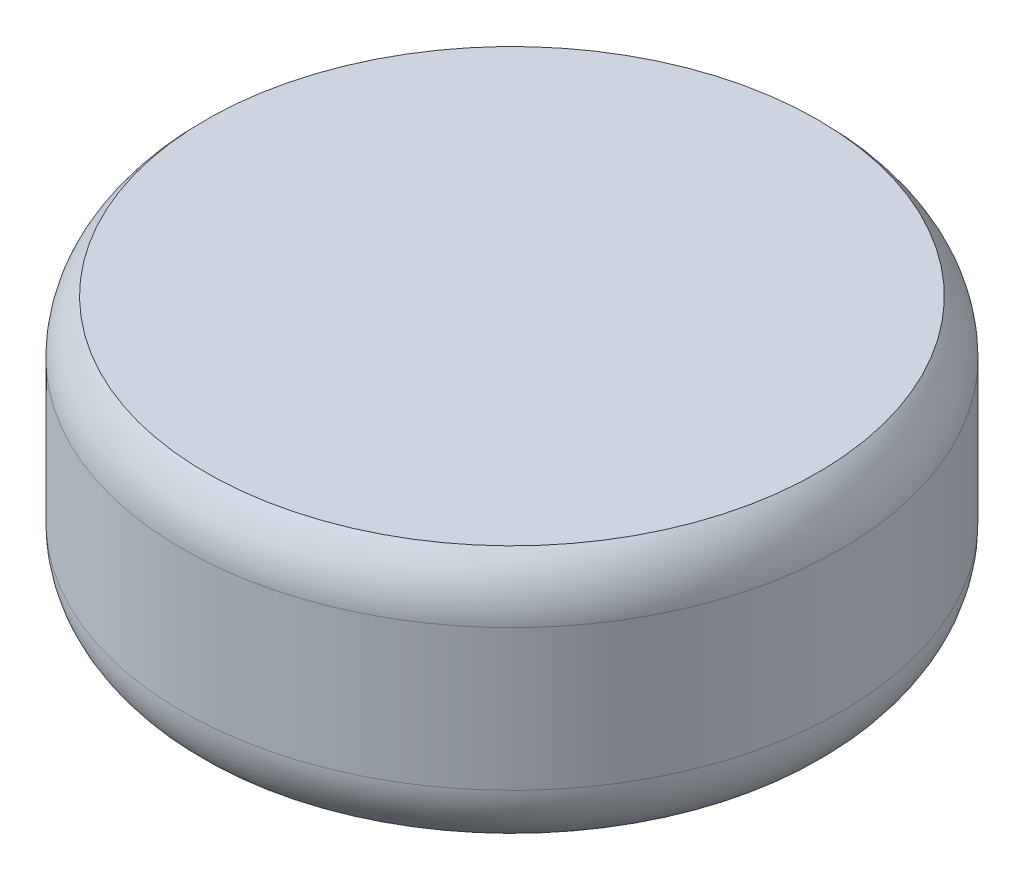
ISO-10303-21;
HEADER;
FILE_DESCRIPTION(('STEP AP214'),'2;1');
FILE_NAME('part.step','',(''),(''),'','','');
FILE_SCHEMA(('AUTOMOTIVE_DESIGN { 1 0 10303 214 1 1 1 1 }'));
ENDSEC;
DATA;
#1=APPLICATION_CONTEXT('core data for automotive mechanical design processes');
#2=APPLICATION_PROTOCOL_DEFINITION('international standard','automotive_design',2000,#1);
#3=PRODUCT_CONTEXT('',#1,'mechanical');
#4=PRODUCT('Part','Part','',(#3));
#5=PRODUCT_RELATED_PRODUCT_CATEGORY('part','',(#4));
#6=PRODUCT_DEFINITION_FORMATION('','',#4);
#7=PRODUCT_DEFINITION_CONTEXT('part definition',#1,'design');
#8=PRODUCT_DEFINITION('design','',#6,#7);
#9=PRODUCT_DEFINITION_SHAPE('','',#8);
#10=(LENGTH_UNIT() NAMED_UNIT(*) SI_UNIT(.MILLI.,.METRE.));
#11=(NAMED_UNIT(*) PLANE_ANGLE_UNIT() SI_UNIT($,.RADIAN.));
#12=(NAMED_UNIT(*) SI_UNIT($,.STERADIAN.) SOLID_ANGLE_UNIT());
#13=UNCERTAINTY_MEASURE_WITH_UNIT(LENGTH_MEASURE(1.E-05),#10,'distance_accuracy_value','');
#14=(GEOMETRIC_REPRESENTATION_CONTEXT(3) GLOBAL_UNCERTAINTY_ASSIGNED_CONTEXT((#13)) GLOBAL_UNIT_ASSIGNED_CONTEXT((#10,
#11,#12)) REPRESENTATION_CONTEXT('',''));
#15=CARTESIAN_POINT('',(0.,0.,0.));
#16=DIRECTION('',(0.,0.,1.));
#17=DIRECTION('',(1.,0.,0.));
#18=AXIS2_PLACEMENT_3D('',#15,#16,#17);
#19=CARTESIAN_POINT('',(0.,0.,0.));
#20=DIRECTION('',(0.,-1.,0.));
#21=DIRECTION('',(0.,0.,-1.));
#22=AXIS2_PLACEMENT_3D('',#19,#20,#21);
#23=PLANE('',#22);
#24=CARTESIAN_POINT('',(0.,0.,0.));
#25=DIRECTION('',(0.,-1.,0.));
#26=DIRECTION('',(0.,0.,-1.));
#27=AXIS2_PLACEMENT_3D('',#24,#25,#26);
#28=CIRCLE('',#27,41.1418645377442);
#29=CARTESIAN_POINT('',(0.,0.,-41.1418645377442));
#30=VERTEX_POINT('',#29);
#31=EDGE_CURVE('E55',#30,#30,#28,.T.);
#32=ORIENTED_EDGE('',*,*,#31,.F.);
#33=EDGE_LOOP('',(#32));
#34=FACE_BOUND('',#33,.T.);
#35=CARTESIAN_POINT('',(0.,0.,0.));
#36=DIRECTION('',(0.,-1.,0.));
#37=DIRECTION('',(0.,0.,-1.));
#38=AXIS2_PLACEMENT_3D('',#35,#36,#37);
#39=CIRCLE('',#38,41.75);
#40=CARTESIAN_POINT('',(0.,0.,-41.75));
#41=VERTEX_POINT('',#40);
#42=EDGE_CURVE('E10',#41,#41,#39,.T.);
#43=ORIENTED_EDGE('',*,*,#42,.T.);
#44=EDGE_LOOP('',(#43));
#45=FACE_BOUND('',#44,.T.);
#46=ADVANCED_FACE('F36',(#34,#45),#23,.T.);
#47=CARTESIAN_POINT('',(0.,7.37817728168684,0.));
#48=DIRECTION('',(0.,-1.,0.));
#49=DIRECTION('',(0.,0.,-1.));
#50=AXIS2_PLACEMENT_3D('',#47,#48,#49);
#51=TOROIDAL_SURFACE('',#50,35.,10.);
#52=CARTESIAN_POINT('',(0.,7.37817728168684,0.));
#53=DIRECTION('',(0.,-1.,0.));
#54=DIRECTION('',(0.,0.,-1.));
#55=AXIS2_PLACEMENT_3D('',#52,#53,#54);
#56=CIRCLE('',#55,45.);
#57=CARTESIAN_POINT('',(0.,7.37817728168684,-45.));
#58=VERTEX_POINT('',#57);
#59=EDGE_CURVE('E42',#58,#58,#56,.T.);
#60=ORIENTED_EDGE('',*,*,#59,.T.);
#61=EDGE_LOOP('',(#60));
#62=FACE_BOUND('',#61,.T.);
#63=ORIENTED_EDGE('',*,*,#42,.F.);
#64=EDGE_LOOP('',(#63));
#65=FACE_BOUND('',#64,.T.);
#66=ADVANCED_FACE('F141',(#62,#65),#51,.T.);
#67=CARTESIAN_POINT('',(0.,34.,0.));
#68=DIRECTION('',(0.,-1.,0.));
#69=DIRECTION('',(0.,0.,-1.));
#70=AXIS2_PLACEMENT_3D('',#67,#68,#69);
#71=CYLINDRICAL_SURFACE('',#70,45.);
#72=CARTESIAN_POINT('',(0.,26.6218227183132,0.));
#73=DIRECTION('',(0.,-1.,0.));
#74=DIRECTION('',(0.,0.,-1.));
#75=AXIS2_PLACEMENT_3D('',#72,#73,#74);
#76=CIRCLE('',#75,45.);
#77=CARTESIAN_POINT('',(0.,26.6218227183132,-45.));
#78=VERTEX_POINT('',#77);
#79=EDGE_CURVE('E46',#78,#78,#76,.T.);
#80=ORIENTED_EDGE('',*,*,#79,.T.);
#81=EDGE_LOOP('',(#80));
#82=FACE_BOUND('',#81,.T.);
#83=ORIENTED_EDGE('',*,*,#59,.F.);
#84=EDGE_LOOP('',(#83));
#85=FACE_BOUND('',#84,.T.);
#86=ADVANCED_FACE('F138',(#82,#85),#71,.T.);
#87=CARTESIAN_POINT('',(0.,26.6218227183132,0.));
#88=DIRECTION('',(0.,-1.,0.));
#89=DIRECTION('',(0.,0.,-1.));
#90=AXIS2_PLACEMENT_3D('',#87,#88,#89);
#91=TOROIDAL_SURFACE('',#90,35.,10.);
#92=CARTESIAN_POINT('',(0.,34.,0.));
#93=DIRECTION('',(0.,-1.,0.));
#94=DIRECTION('',(0.,0.,-1.));
#95=AXIS2_PLACEMENT_3D('',#92,#93,#94);
#96=CIRCLE('',#95,41.75);
#97=CARTESIAN_POINT('',(0.,34.,-41.75));
#98=VERTEX_POINT('',#97);
#99=EDGE_CURVE('E50',#98,#98,#96,.T.);
#100=ORIENTED_EDGE('',*,*,#99,.T.);
#101=EDGE_LOOP('',(#100));
#102=FACE_BOUND('',#101,.T.);
#103=ORIENTED_EDGE('',*,*,#79,.F.);
#104=EDGE_LOOP('',(#103));
#105=FACE_BOUND('',#104,.T.);
#106=ADVANCED_FACE('F134',(#102,#105),#91,.T.);
#107=CARTESIAN_POINT('',(0.,34.,0.));
#108=DIRECTION('',(0.,1.,0.));
#109=DIRECTION('',(0.,0.,1.));
#110=AXIS2_PLACEMENT_3D('',#107,#108,#109);
#111=PLANE('',#110);
#112=ORIENTED_EDGE('',*,*,#99,.F.);
#113=EDGE_LOOP('',(#112));
#114=FACE_BOUND('',#113,.T.);
#115=ADVANCED_FACE('F119',(#114),#111,.T.);
#116=CARTESIAN_POINT('',(0.,7.37817728168684,0.));
#117=DIRECTION('',(0.,-1.,0.));
#118=DIRECTION('',(0.,0.,-1.));
#119=AXIS2_PLACEMENT_3D('',#116,#117,#118);
#120=TOROIDAL_SURFACE('',#119,35.,9.60000000000001);
#121=CARTESIAN_POINT('',(0.,7.37817728168684,0.));
#122=DIRECTION('',(0.,-1.,0.));
#123=DIRECTION('',(0.,0.,-1.));
#124=AXIS2_PLACEMENT_3D('',#121,#122,#123);
#125=CIRCLE('',#124,44.6);
#126=CARTESIAN_POINT('',(0.,7.37817728168684,-44.6));
#127=VERTEX_POINT('',#126);
#128=EDGE_CURVE('E58',#127,#127,#125,.T.);
#129=ORIENTED_EDGE('',*,*,#128,.F.);
#130=EDGE_LOOP('',(#129));
#131=FACE_BOUND('',#130,.T.);
#132=ORIENTED_EDGE('',*,*,#31,.T.);
#133=EDGE_LOOP('',(#132));
#134=FACE_BOUND('',#133,.T.);
#135=ADVANCED_FACE('F115',(#131,#134),#120,.F.);
#136=CARTESIAN_POINT('',(0.,34.,0.));
#137=DIRECTION('',(0.,-1.,0.));
#138=DIRECTION('',(0.,0.,-1.));
#139=AXIS2_PLACEMENT_3D('',#136,#137,#138);
#140=CYLINDRICAL_SURFACE('',#139,44.6);
#141=CARTESIAN_POINT('',(0.,26.6218227183132,0.));
#142=DIRECTION('',(0.,-1.,0.));
#143=DIRECTION('',(0.,0.,-1.));
#144=AXIS2_PLACEMENT_3D('',#141,#142,#143);
#145=CIRCLE('',#144,44.6);
#146=CARTESIAN_POINT('',(0.,26.6218227183132,-44.6));
#147=VERTEX_POINT('',#146);
#148=EDGE_CURVE('E62',#147,#147,#145,.T.);
#149=ORIENTED_EDGE('',*,*,#148,.F.);
#150=EDGE_LOOP('',(#149));
#151=FACE_BOUND('',#150,.T.);
#152=ORIENTED_EDGE('',*,*,#128,.T.);
#153=EDGE_LOOP('',(#152));
#154=FACE_BOUND('',#153,.T.);
#155=ADVANCED_FACE('F118',(#151,#154),#140,.F.);
#156=CARTESIAN_POINT('',(0.,26.6218227183132,0.));
#157=DIRECTION('',(0.,-1.,0.));
#158=DIRECTION('',(0.,0.,-1.));
#159=AXIS2_PLACEMENT_3D('',#156,#157,#158);
#160=TOROIDAL_SURFACE('',#159,35.,9.60000000000001);
#161=CARTESIAN_POINT('',(0.,33.,0.));
#162=DIRECTION('',(0.,1.,0.));
#163=DIRECTION('',(0.,0.,1.));
#164=AXIS2_PLACEMENT_3D('',#161,#162,#163);
#165=CIRCLE('',#164,42.1748766235646);
#166=CARTESIAN_POINT('',(0.,33.,42.1748766235646));
#167=VERTEX_POINT('',#166);
#168=EDGE_CURVE('E59',#167,#167,#165,.F.);
#169=ORIENTED_EDGE('',*,*,#168,.F.);
#170=EDGE_LOOP('',(#169));
#171=FACE_BOUND('',#170,.T.);
#172=ORIENTED_EDGE('',*,*,#148,.T.);
#173=EDGE_LOOP('',(#172));
#174=FACE_BOUND('',#173,.T.);
#175=ADVANCED_FACE('F123',(#171,#174),#160,.F.);
#176=CARTESIAN_POINT('',(0.,33.,0.));
#177=DIRECTION('',(0.,1.,0.));
#178=DIRECTION('',(0.,0.,1.));
#179=AXIS2_PLACEMENT_3D('',#176,#177,#178);
#180=PLANE('',#179);
#181=ORIENTED_EDGE('',*,*,#168,.T.);
#182=EDGE_LOOP('',(#181));
#183=FACE_BOUND('',#182,.T.);
#184=ADVANCED_FACE('F127',(#183),#180,.F.);
#185=CLOSED_SHELL('',(#46,#66,#86,#106,#115,#135,#155,#175,#184));
#186=CARTESIAN_POINT('',(-31.5,33.4,0.));
#187=DIRECTION('',(0.,1.,0.));
#188=DIRECTION('',(0.,0.,1.));
#189=AXIS2_PLACEMENT_3D('',#186,#187,#188);
#190=CYLINDRICAL_SURFACE('',#189,1.);
#191=CARTESIAN_POINT('',(-31.5,33.4,0.));
#192=DIRECTION('',(0.,1.,0.));
#193=DIRECTION('',(0.,0.,1.));
#194=AXIS2_PLACEMENT_3D('',#191,#192,#193);
#195=CIRCLE('',#194,1.);
#196=CARTESIAN_POINT('',(-31.5,33.4,1.));
#197=VERTEX_POINT('',#196);
#198=EDGE_CURVE('E63',#197,#197,#195,.T.);
#199=ORIENTED_EDGE('',*,*,#198,.F.);
#200=EDGE_LOOP('',(#199));
#201=FACE_BOUND('',#200,.T.);
#202=CARTESIAN_POINT('',(-31.5,33.8,0.));
#203=DIRECTION('',(0.,1.,0.));
#204=DIRECTION('',(0.,0.,1.));
#205=AXIS2_PLACEMENT_3D('',#202,#203,#204);
#206=CIRCLE('',#205,1.);
#207=CARTESIAN_POINT('',(-31.5,33.8,1.));
#208=VERTEX_POINT('',#207);
#209=EDGE_CURVE('E74',#208,#208,#206,.T.);
#210=ORIENTED_EDGE('',*,*,#209,.T.);
#211=EDGE_LOOP('',(#210));
#212=FACE_BOUND('',#211,.T.);
#213=ADVANCED_FACE('F82',(#201,#212),#190,.F.);
#214=CARTESIAN_POINT('',(-31.5,33.4,0.));
#215=DIRECTION('',(0.,1.,0.));
#216=DIRECTION('',(0.,0.,1.));
#217=AXIS2_PLACEMENT_3D('',#214,#215,#216);
#218=PLANE('',#217);
#219=ORIENTED_EDGE('',*,*,#198,.T.);
#220=EDGE_LOOP('',(#219));
#221=FACE_BOUND('',#220,.T.);
#222=ADVANCED_FACE('F80',(#221),#218,.T.);
#223=CARTESIAN_POINT('',(-31.5,33.8,0.));
#224=DIRECTION('',(0.,1.,0.));
#225=DIRECTION('',(0.,0.,1.));
#226=AXIS2_PLACEMENT_3D('',#223,#224,#225);
#227=PLANE('',#226);
#228=ORIENTED_EDGE('',*,*,#209,.F.);
#229=EDGE_LOOP('',(#228));
#230=FACE_BOUND('',#229,.T.);
#231=ADVANCED_FACE('F89',(#230),#227,.F.);
#232=CLOSED_SHELL('',(#213,#222,#231));
#233=CARTESIAN_POINT('',(31.5,33.4,0.));
#234=DIRECTION('',(0.,1.,0.));
#235=DIRECTION('',(0.,0.,1.));
#236=AXIS2_PLACEMENT_3D('',#233,#234,#235);
#237=CYLINDRICAL_SURFACE('',#236,0.999999999999998);
#238=CARTESIAN_POINT('',(31.5,33.4,0.));
#239=DIRECTION('',(0.,1.,0.));
#240=DIRECTION('',(0.,0.,-1.));
#241=AXIS2_PLACEMENT_3D('',#238,#239,#240);
#242=CIRCLE('',#241,0.999999999999998);
#243=CARTESIAN_POINT('',(31.5,33.4,-0.999999999999998));
#244=VERTEX_POINT('',#243);
#245=EDGE_CURVE('E71',#244,#244,#242,.T.);
#246=ORIENTED_EDGE('',*,*,#245,.F.);
#247=EDGE_LOOP('',(#246));
#248=FACE_BOUND('',#247,.T.);
#249=CARTESIAN_POINT('',(31.5,33.8,0.));
#250=DIRECTION('',(0.,1.,0.));
#251=DIRECTION('',(0.,0.,-1.));
#252=AXIS2_PLACEMENT_3D('',#249,#250,#251);
#253=CIRCLE('',#252,0.999999999999998);
#254=CARTESIAN_POINT('',(31.5,33.8,-0.999999999999998));
#255=VERTEX_POINT('',#254);
#256=EDGE_CURVE('E68',#255,#255,#253,.T.);
#257=ORIENTED_EDGE('',*,*,#256,.T.);
#258=EDGE_LOOP('',(#257));
#259=FACE_BOUND('',#258,.T.);
#260=ADVANCED_FACE('F101',(#248,#259),#237,.F.);
#261=CARTESIAN_POINT('',(31.5,33.4,0.));
#262=DIRECTION('',(0.,-1.,0.));
#263=DIRECTION('',(0.,0.,-1.));
#264=AXIS2_PLACEMENT_3D('',#261,#262,#263);
#265=PLANE('',#264);
#266=ORIENTED_EDGE('',*,*,#245,.T.);
#267=EDGE_LOOP('',(#266));
#268=FACE_BOUND('',#267,.T.);
#269=ADVANCED_FACE('F102',(#268),#265,.F.);
#270=CARTESIAN_POINT('',(31.5,33.8,0.));
#271=DIRECTION('',(0.,-1.,0.));
#272=DIRECTION('',(0.,0.,-1.));
#273=AXIS2_PLACEMENT_3D('',#270,#271,#272);
#274=PLANE('',#273);
#275=ORIENTED_EDGE('',*,*,#256,.F.);
#276=EDGE_LOOP('',(#275));
#277=FACE_BOUND('',#276,.T.);
#278=ADVANCED_FACE('F108',(#277),#274,.T.);
#279=CLOSED_SHELL('',(#260,#269,#278));
#280=ORIENTED_CLOSED_SHELL('',*,#232,.T.);
#281=ORIENTED_CLOSED_SHELL('',*,#279,.T.);
#282=BREP_WITH_VOIDS('B2',#185,(#280,#281));
#283=ADVANCED_BREP_SHAPE_REPRESENTATION('',(#18,#282),#14);
#284=SHAPE_DEFINITION_REPRESENTATION(#9,#283);
ENDSEC;
END-ISO-10303-21;
